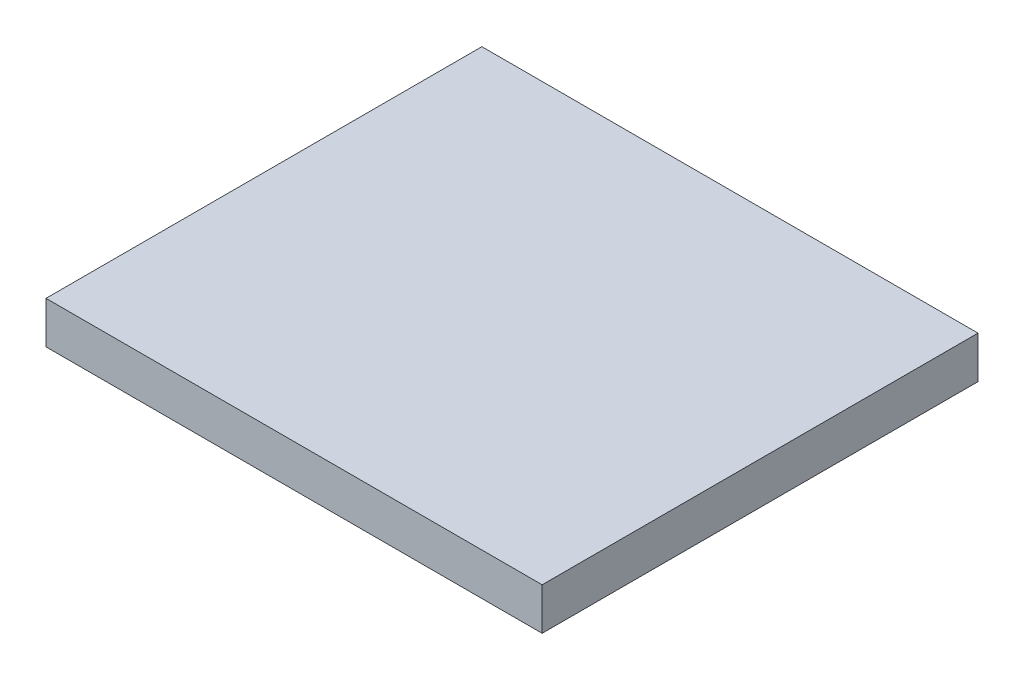
ISO-10303-21;
HEADER;
FILE_DESCRIPTION(('STEP AP214'),'2;1');
FILE_NAME('part.step','',(''),(''),'','','');
FILE_SCHEMA(('AUTOMOTIVE_DESIGN { 1 0 10303 214 1 1 1 1 }'));
ENDSEC;
DATA;
#1=APPLICATION_CONTEXT('core data for automotive mechanical design processes');
#2=APPLICATION_PROTOCOL_DEFINITION('international standard','automotive_design',2000,#1);
#3=PRODUCT_CONTEXT('',#1,'mechanical');
#4=PRODUCT('Part','Part','',(#3));
#5=PRODUCT_RELATED_PRODUCT_CATEGORY('part','',(#4));
#6=PRODUCT_DEFINITION_FORMATION('','',#4);
#7=PRODUCT_DEFINITION_CONTEXT('part definition',#1,'design');
#8=PRODUCT_DEFINITION('design','',#6,#7);
#9=PRODUCT_DEFINITION_SHAPE('','',#8);
#10=(LENGTH_UNIT() NAMED_UNIT(*) SI_UNIT(.MILLI.,.METRE.));
#11=(NAMED_UNIT(*) PLANE_ANGLE_UNIT() SI_UNIT($,.RADIAN.));
#12=(NAMED_UNIT(*) SI_UNIT($,.STERADIAN.) SOLID_ANGLE_UNIT());
#13=UNCERTAINTY_MEASURE_WITH_UNIT(LENGTH_MEASURE(1.E-05),#10,'distance_accuracy_value','');
#14=(GEOMETRIC_REPRESENTATION_CONTEXT(3) GLOBAL_UNCERTAINTY_ASSIGNED_CONTEXT((#13)) GLOBAL_UNIT_ASSIGNED_CONTEXT((#10,
#11,#12)) REPRESENTATION_CONTEXT('',''));
#15=CARTESIAN_POINT('',(0.,0.,0.));
#16=DIRECTION('',(0.,0.,1.));
#17=DIRECTION('',(1.,0.,0.));
#18=AXIS2_PLACEMENT_3D('',#15,#16,#17);
#19=CARTESIAN_POINT('',(17.7,3.,15.55));
#20=DIRECTION('',(-1.,0.,0.));
#21=DIRECTION('',(0.,0.,1.));
#22=AXIS2_PLACEMENT_3D('',#19,#20,#21);
#23=PLANE('',#22);
#24=DIRECTION('',(0.,0.,-1.));
#25=VECTOR('',#24,1.);
#26=CARTESIAN_POINT('',(17.7,0.,15.55));
#27=LINE('',#26,#25);
#28=CARTESIAN_POINT('',(17.7,0.,15.55));
#29=VERTEX_POINT('',#28);
#30=CARTESIAN_POINT('',(17.7,0.,-15.55));
#31=VERTEX_POINT('',#30);
#32=EDGE_CURVE('E96',#29,#31,#27,.T.);
#33=ORIENTED_EDGE('',*,*,#32,.T.);
#34=DIRECTION('',(0.,-1.,0.));
#35=VECTOR('',#34,1.);
#36=CARTESIAN_POINT('',(17.7,3.,-15.55));
#37=LINE('',#36,#35);
#38=CARTESIAN_POINT('',(17.7,3.,-15.55));
#39=VERTEX_POINT('',#38);
#40=EDGE_CURVE('E11',#39,#31,#37,.T.);
#41=ORIENTED_EDGE('',*,*,#40,.F.);
#42=DIRECTION('',(0.,0.,-1.));
#43=VECTOR('',#42,1.);
#44=CARTESIAN_POINT('',(17.7,3.,15.55));
#45=LINE('',#44,#43);
#46=CARTESIAN_POINT('',(17.7,3.,15.55));
#47=VERTEX_POINT('',#46);
#48=EDGE_CURVE('E84',#47,#39,#45,.T.);
#49=ORIENTED_EDGE('',*,*,#48,.F.);
#50=DIRECTION('',(0.,-1.,0.));
#51=VECTOR('',#50,1.);
#52=CARTESIAN_POINT('',(17.7,3.,15.55));
#53=LINE('',#52,#51);
#54=EDGE_CURVE('E92',#47,#29,#53,.T.);
#55=ORIENTED_EDGE('',*,*,#54,.T.);
#56=EDGE_LOOP('',(#33,#41,#49,#55));
#57=FACE_BOUND('',#56,.T.);
#58=ADVANCED_FACE('F33',(#57),#23,.F.);
#59=CARTESIAN_POINT('',(-17.7,3.,-15.55));
#60=DIRECTION('',(0.,0.,1.));
#61=DIRECTION('',(1.,0.,0.));
#62=AXIS2_PLACEMENT_3D('',#59,#60,#61);
#63=PLANE('',#62);
#64=DIRECTION('',(-1.,0.,0.));
#65=VECTOR('',#64,1.);
#66=CARTESIAN_POINT('',(-17.7,0.,-15.55));
#67=LINE('',#66,#65);
#68=CARTESIAN_POINT('',(-17.7,0.,-15.55));
#69=VERTEX_POINT('',#68);
#70=EDGE_CURVE('E88',#31,#69,#67,.T.);
#71=ORIENTED_EDGE('',*,*,#70,.T.);
#72=DIRECTION('',(0.,-1.,0.));
#73=VECTOR('',#72,1.);
#74=CARTESIAN_POINT('',(-17.7,3.,-15.55));
#75=LINE('',#74,#73);
#76=CARTESIAN_POINT('',(-17.7,3.,-15.55));
#77=VERTEX_POINT('',#76);
#78=EDGE_CURVE('E41',#77,#69,#75,.T.);
#79=ORIENTED_EDGE('',*,*,#78,.F.);
#80=DIRECTION('',(-1.,0.,0.));
#81=VECTOR('',#80,1.);
#82=CARTESIAN_POINT('',(-17.7,3.,-15.55));
#83=LINE('',#82,#81);
#84=EDGE_CURVE('E79',#39,#77,#83,.T.);
#85=ORIENTED_EDGE('',*,*,#84,.F.);
#86=ORIENTED_EDGE('',*,*,#40,.T.);
#87=EDGE_LOOP('',(#71,#79,#85,#86));
#88=FACE_BOUND('',#87,.T.);
#89=ADVANCED_FACE('F87',(#88),#63,.F.);
#90=CARTESIAN_POINT('',(-17.7,3.,15.55));
#91=DIRECTION('',(1.,0.,0.));
#92=DIRECTION('',(0.,0.,-1.));
#93=AXIS2_PLACEMENT_3D('',#90,#91,#92);
#94=PLANE('',#93);
#95=DIRECTION('',(0.,0.,1.));
#96=VECTOR('',#95,1.);
#97=CARTESIAN_POINT('',(-17.7,0.,15.55));
#98=LINE('',#97,#96);
#99=CARTESIAN_POINT('',(-17.7,0.,15.55));
#100=VERTEX_POINT('',#99);
#101=EDGE_CURVE('E66',#69,#100,#98,.T.);
#102=ORIENTED_EDGE('',*,*,#101,.T.);
#103=DIRECTION('',(0.,-1.,0.));
#104=VECTOR('',#103,1.);
#105=CARTESIAN_POINT('',(-17.7,3.,15.55));
#106=LINE('',#105,#104);
#107=CARTESIAN_POINT('',(-17.7,3.,15.55));
#108=VERTEX_POINT('',#107);
#109=EDGE_CURVE('E89',#108,#100,#106,.T.);
#110=ORIENTED_EDGE('',*,*,#109,.F.);
#111=DIRECTION('',(0.,0.,1.));
#112=VECTOR('',#111,1.);
#113=CARTESIAN_POINT('',(-17.7,3.,15.55));
#114=LINE('',#113,#112);
#115=EDGE_CURVE('E82',#77,#108,#114,.T.);
#116=ORIENTED_EDGE('',*,*,#115,.F.);
#117=ORIENTED_EDGE('',*,*,#78,.T.);
#118=EDGE_LOOP('',(#102,#110,#116,#117));
#119=FACE_BOUND('',#118,.T.);
#120=ADVANCED_FACE('F90',(#119),#94,.F.);
#121=CARTESIAN_POINT('',(-17.7,3.,15.55));
#122=DIRECTION('',(0.,0.,-1.));
#123=DIRECTION('',(-1.,0.,0.));
#124=AXIS2_PLACEMENT_3D('',#121,#122,#123);
#125=PLANE('',#124);
#126=DIRECTION('',(1.,0.,0.));
#127=VECTOR('',#126,1.);
#128=CARTESIAN_POINT('',(-17.7,0.,15.55));
#129=LINE('',#128,#127);
#130=EDGE_CURVE('E72',#100,#29,#129,.T.);
#131=ORIENTED_EDGE('',*,*,#130,.T.);
#132=ORIENTED_EDGE('',*,*,#54,.F.);
#133=DIRECTION('',(1.,0.,0.));
#134=VECTOR('',#133,1.);
#135=CARTESIAN_POINT('',(-17.7,3.,15.55));
#136=LINE('',#135,#134);
#137=EDGE_CURVE('E49',#108,#47,#136,.T.);
#138=ORIENTED_EDGE('',*,*,#137,.F.);
#139=ORIENTED_EDGE('',*,*,#109,.T.);
#140=EDGE_LOOP('',(#131,#132,#138,#139));
#141=FACE_BOUND('',#140,.T.);
#142=ADVANCED_FACE('F103',(#141),#125,.F.);
#143=CARTESIAN_POINT('',(0.,3.,0.));
#144=DIRECTION('',(0.,-1.,0.));
#145=DIRECTION('',(0.,0.,-1.));
#146=AXIS2_PLACEMENT_3D('',#143,#144,#145);
#147=PLANE('',#146);
#148=ORIENTED_EDGE('',*,*,#48,.T.);
#149=ORIENTED_EDGE('',*,*,#84,.T.);
#150=ORIENTED_EDGE('',*,*,#115,.T.);
#151=ORIENTED_EDGE('',*,*,#137,.T.);
#152=EDGE_LOOP('',(#148,#149,#150,#151));
#153=FACE_BOUND('',#152,.T.);
#154=ADVANCED_FACE('F80',(#153),#147,.F.);
#155=CARTESIAN_POINT('',(0.,0.,0.));
#156=DIRECTION('',(0.,-1.,0.));
#157=DIRECTION('',(0.,0.,-1.));
#158=AXIS2_PLACEMENT_3D('',#155,#156,#157);
#159=PLANE('',#158);
#160=ORIENTED_EDGE('',*,*,#32,.F.);
#161=ORIENTED_EDGE('',*,*,#130,.F.);
#162=ORIENTED_EDGE('',*,*,#101,.F.);
#163=ORIENTED_EDGE('',*,*,#70,.F.);
#164=EDGE_LOOP('',(#160,#161,#162,#163));
#165=FACE_BOUND('',#164,.T.);
#166=ADVANCED_FACE('F106',(#165),#159,.T.);
#167=CLOSED_SHELL('',(#58,#89,#120,#142,#154,#166));
#168=MANIFOLD_SOLID_BREP('B2',#167);
#169=ADVANCED_BREP_SHAPE_REPRESENTATION('',(#18,#168),#14);
#170=SHAPE_DEFINITION_REPRESENTATION(#9,#169);
ENDSEC;
END-ISO-10303-21;
